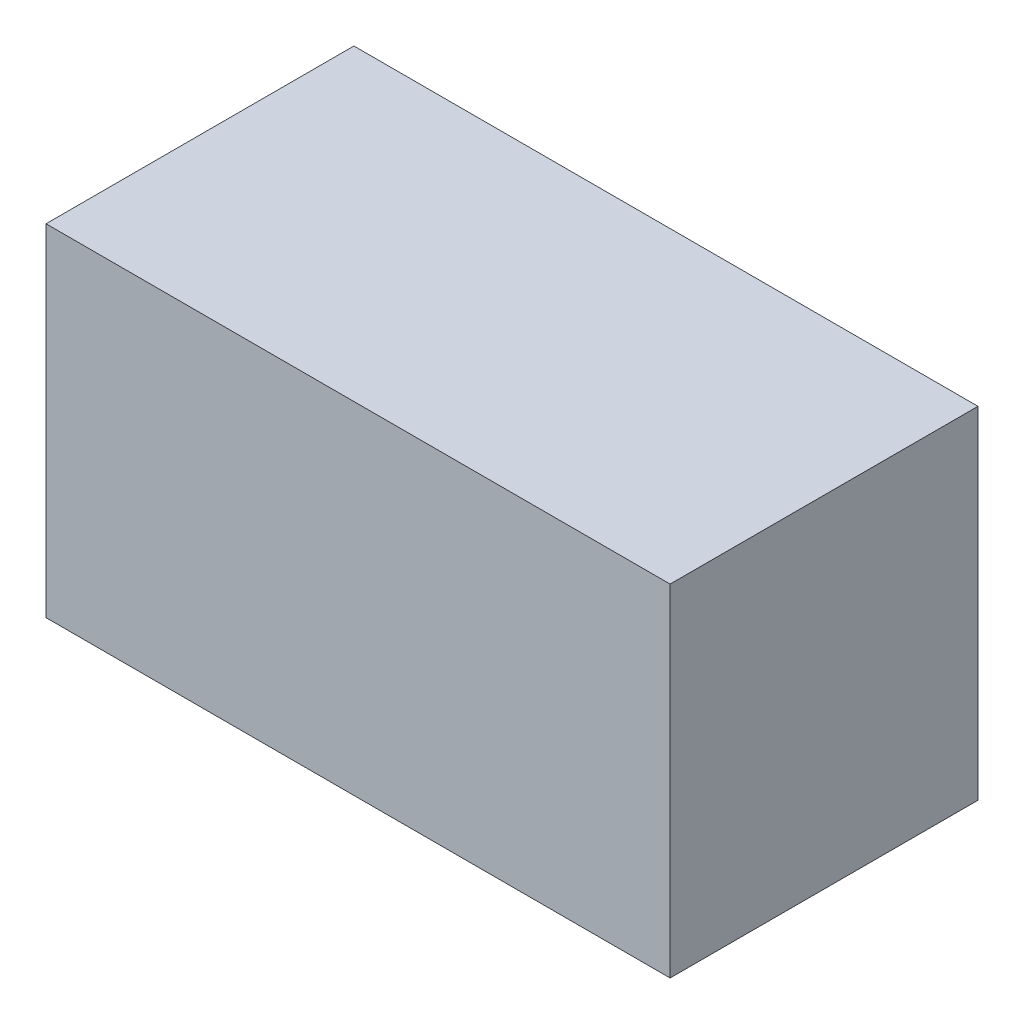
ISO-10303-21;
HEADER;
FILE_DESCRIPTION(('STEP AP214'),'2;1');
FILE_NAME('part.step','',(''),(''),'','','');
FILE_SCHEMA(('AUTOMOTIVE_DESIGN { 1 0 10303 214 1 1 1 1 }'));
ENDSEC;
DATA;
#1=APPLICATION_CONTEXT('core data for automotive mechanical design processes');
#2=APPLICATION_PROTOCOL_DEFINITION('international standard','automotive_design',2000,#1);
#3=PRODUCT_CONTEXT('',#1,'mechanical');
#4=PRODUCT('Part','Part','',(#3));
#5=PRODUCT_RELATED_PRODUCT_CATEGORY('part','',(#4));
#6=PRODUCT_DEFINITION_FORMATION('','',#4);
#7=PRODUCT_DEFINITION_CONTEXT('part definition',#1,'design');
#8=PRODUCT_DEFINITION('design','',#6,#7);
#9=PRODUCT_DEFINITION_SHAPE('','',#8);
#10=(LENGTH_UNIT() NAMED_UNIT(*) SI_UNIT(.MILLI.,.METRE.));
#11=(NAMED_UNIT(*) PLANE_ANGLE_UNIT() SI_UNIT($,.RADIAN.));
#12=(NAMED_UNIT(*) SI_UNIT($,.STERADIAN.) SOLID_ANGLE_UNIT());
#13=UNCERTAINTY_MEASURE_WITH_UNIT(LENGTH_MEASURE(1.E-05),#10,'distance_accuracy_value','');
#14=(GEOMETRIC_REPRESENTATION_CONTEXT(3) GLOBAL_UNCERTAINTY_ASSIGNED_CONTEXT((#13)) GLOBAL_UNIT_ASSIGNED_CONTEXT((#10,
#11,#12)) REPRESENTATION_CONTEXT('',''));
#15=CARTESIAN_POINT('',(0.,0.,0.));
#16=DIRECTION('',(0.,0.,1.));
#17=DIRECTION('',(1.,0.,0.));
#18=AXIS2_PLACEMENT_3D('',#15,#16,#17);
#19=CARTESIAN_POINT('',(0.,0.,3.7));
#20=DIRECTION('',(0.,0.,1.));
#21=DIRECTION('',(1.,0.,0.));
#22=AXIS2_PLACEMENT_3D('',#19,#20,#21);
#23=PLANE('',#22);
#24=DIRECTION('',(0.,1.,0.));
#25=VECTOR('',#24,1.);
#26=CARTESIAN_POINT('',(-7.5,4.1,3.7));
#27=LINE('',#26,#25);
#28=CARTESIAN_POINT('',(-7.5,-4.1,3.7));
#29=VERTEX_POINT('',#28);
#30=CARTESIAN_POINT('',(-7.5,4.1,3.7));
#31=VERTEX_POINT('',#30);
#32=EDGE_CURVE('E83',#29,#31,#27,.T.);
#33=ORIENTED_EDGE('',*,*,#32,.F.);
#34=DIRECTION('',(-1.,0.,0.));
#35=VECTOR('',#34,1.);
#36=CARTESIAN_POINT('',(-7.5,-4.1,3.7));
#37=LINE('',#36,#35);
#38=CARTESIAN_POINT('',(7.5,-4.1,3.7));
#39=VERTEX_POINT('',#38);
#40=EDGE_CURVE('E10',#39,#29,#37,.T.);
#41=ORIENTED_EDGE('',*,*,#40,.F.);
#42=DIRECTION('',(0.,-1.,0.));
#43=VECTOR('',#42,1.);
#44=CARTESIAN_POINT('',(7.5,-4.1,3.7));
#45=LINE('',#44,#43);
#46=CARTESIAN_POINT('',(7.5,4.1,3.7));
#47=VERTEX_POINT('',#46);
#48=EDGE_CURVE('E19',#47,#39,#45,.T.);
#49=ORIENTED_EDGE('',*,*,#48,.F.);
#50=DIRECTION('',(1.,0.,0.));
#51=VECTOR('',#50,1.);
#52=CARTESIAN_POINT('',(7.5,4.1,3.7));
#53=LINE('',#52,#51);
#54=EDGE_CURVE('E86',#31,#47,#53,.T.);
#55=ORIENTED_EDGE('',*,*,#54,.F.);
#56=EDGE_LOOP('',(#33,#41,#49,#55));
#57=FACE_BOUND('',#56,.T.);
#58=ADVANCED_FACE('F15',(#57),#23,.T.);
#59=CARTESIAN_POINT('',(7.5,-4.1,0.));
#60=DIRECTION('',(0.,-1.,0.));
#61=DIRECTION('',(0.,0.,-1.));
#62=AXIS2_PLACEMENT_3D('',#59,#60,#61);
#63=PLANE('',#62);
#64=ORIENTED_EDGE('',*,*,#40,.T.);
#65=DIRECTION('',(0.,0.,-1.));
#66=VECTOR('',#65,1.);
#67=CARTESIAN_POINT('',(-7.5,-4.1,0.));
#68=LINE('',#67,#66);
#69=CARTESIAN_POINT('',(-7.5,-4.1,-3.7));
#70=VERTEX_POINT('',#69);
#71=EDGE_CURVE('E65',#29,#70,#68,.T.);
#72=ORIENTED_EDGE('',*,*,#71,.T.);
#73=DIRECTION('',(1.,0.,0.));
#74=VECTOR('',#73,1.);
#75=CARTESIAN_POINT('',(-7.5,-4.1,-3.7));
#76=LINE('',#75,#74);
#77=CARTESIAN_POINT('',(7.5,-4.1,-3.7));
#78=VERTEX_POINT('',#77);
#79=EDGE_CURVE('E62',#70,#78,#76,.T.);
#80=ORIENTED_EDGE('',*,*,#79,.T.);
#81=DIRECTION('',(0.,0.,1.));
#82=VECTOR('',#81,1.);
#83=CARTESIAN_POINT('',(7.5,-4.1,0.));
#84=LINE('',#83,#82);
#85=EDGE_CURVE('E25',#78,#39,#84,.T.);
#86=ORIENTED_EDGE('',*,*,#85,.T.);
#87=EDGE_LOOP('',(#64,#72,#80,#86));
#88=FACE_BOUND('',#87,.T.);
#89=ADVANCED_FACE('F63',(#88),#63,.T.);
#90=CARTESIAN_POINT('',(7.5,4.1,0.));
#91=DIRECTION('',(1.,0.,0.));
#92=DIRECTION('',(0.,0.,-1.));
#93=AXIS2_PLACEMENT_3D('',#90,#91,#92);
#94=PLANE('',#93);
#95=ORIENTED_EDGE('',*,*,#48,.T.);
#96=ORIENTED_EDGE('',*,*,#85,.F.);
#97=DIRECTION('',(0.,1.,0.));
#98=VECTOR('',#97,1.);
#99=CARTESIAN_POINT('',(7.5,-4.1,-3.7));
#100=LINE('',#99,#98);
#101=CARTESIAN_POINT('',(7.5,4.1,-3.7));
#102=VERTEX_POINT('',#101);
#103=EDGE_CURVE('E57',#78,#102,#100,.T.);
#104=ORIENTED_EDGE('',*,*,#103,.T.);
#105=DIRECTION('',(0.,0.,1.));
#106=VECTOR('',#105,1.);
#107=CARTESIAN_POINT('',(7.5,4.1,0.));
#108=LINE('',#107,#106);
#109=EDGE_CURVE('E91',#102,#47,#108,.T.);
#110=ORIENTED_EDGE('',*,*,#109,.T.);
#111=EDGE_LOOP('',(#95,#96,#104,#110));
#112=FACE_BOUND('',#111,.T.);
#113=ADVANCED_FACE('F55',(#112),#94,.T.);
#114=CARTESIAN_POINT('',(-7.5,4.1,0.));
#115=DIRECTION('',(0.,1.,0.));
#116=DIRECTION('',(0.,0.,1.));
#117=AXIS2_PLACEMENT_3D('',#114,#115,#116);
#118=PLANE('',#117);
#119=ORIENTED_EDGE('',*,*,#54,.T.);
#120=ORIENTED_EDGE('',*,*,#109,.F.);
#121=DIRECTION('',(-1.,0.,0.));
#122=VECTOR('',#121,1.);
#123=CARTESIAN_POINT('',(7.5,4.1,-3.7));
#124=LINE('',#123,#122);
#125=CARTESIAN_POINT('',(-7.5,4.1,-3.7));
#126=VERTEX_POINT('',#125);
#127=EDGE_CURVE('E75',#102,#126,#124,.T.);
#128=ORIENTED_EDGE('',*,*,#127,.T.);
#129=DIRECTION('',(0.,0.,1.));
#130=VECTOR('',#129,1.);
#131=CARTESIAN_POINT('',(-7.5,4.1,0.));
#132=LINE('',#131,#130);
#133=EDGE_CURVE('E87',#126,#31,#132,.T.);
#134=ORIENTED_EDGE('',*,*,#133,.T.);
#135=EDGE_LOOP('',(#119,#120,#128,#134));
#136=FACE_BOUND('',#135,.T.);
#137=ADVANCED_FACE('F103',(#136),#118,.T.);
#138=CARTESIAN_POINT('',(-7.5,-4.1,0.));
#139=DIRECTION('',(-1.,0.,0.));
#140=DIRECTION('',(0.,0.,1.));
#141=AXIS2_PLACEMENT_3D('',#138,#139,#140);
#142=PLANE('',#141);
#143=ORIENTED_EDGE('',*,*,#32,.T.);
#144=ORIENTED_EDGE('',*,*,#133,.F.);
#145=DIRECTION('',(0.,-1.,0.));
#146=VECTOR('',#145,1.);
#147=CARTESIAN_POINT('',(-7.5,4.1,-3.7));
#148=LINE('',#147,#146);
#149=EDGE_CURVE('E70',#126,#70,#148,.T.);
#150=ORIENTED_EDGE('',*,*,#149,.T.);
#151=ORIENTED_EDGE('',*,*,#71,.F.);
#152=EDGE_LOOP('',(#143,#144,#150,#151));
#153=FACE_BOUND('',#152,.T.);
#154=ADVANCED_FACE('F17',(#153),#142,.T.);
#155=CARTESIAN_POINT('',(0.,0.,-3.7));
#156=DIRECTION('',(0.,0.,1.));
#157=DIRECTION('',(1.,0.,0.));
#158=AXIS2_PLACEMENT_3D('',#155,#156,#157);
#159=PLANE('',#158);
#160=ORIENTED_EDGE('',*,*,#103,.F.);
#161=ORIENTED_EDGE('',*,*,#79,.F.);
#162=ORIENTED_EDGE('',*,*,#149,.F.);
#163=ORIENTED_EDGE('',*,*,#127,.F.);
#164=EDGE_LOOP('',(#160,#161,#162,#163));
#165=FACE_BOUND('',#164,.T.);
#166=ADVANCED_FACE('F73',(#165),#159,.F.);
#167=CLOSED_SHELL('',(#58,#89,#113,#137,#154,#166));
#168=MANIFOLD_SOLID_BREP('B1',#167);
#169=ADVANCED_BREP_SHAPE_REPRESENTATION('',(#18,#168),#14);
#170=SHAPE_DEFINITION_REPRESENTATION(#9,#169);
ENDSEC;
END-ISO-10303-21;
